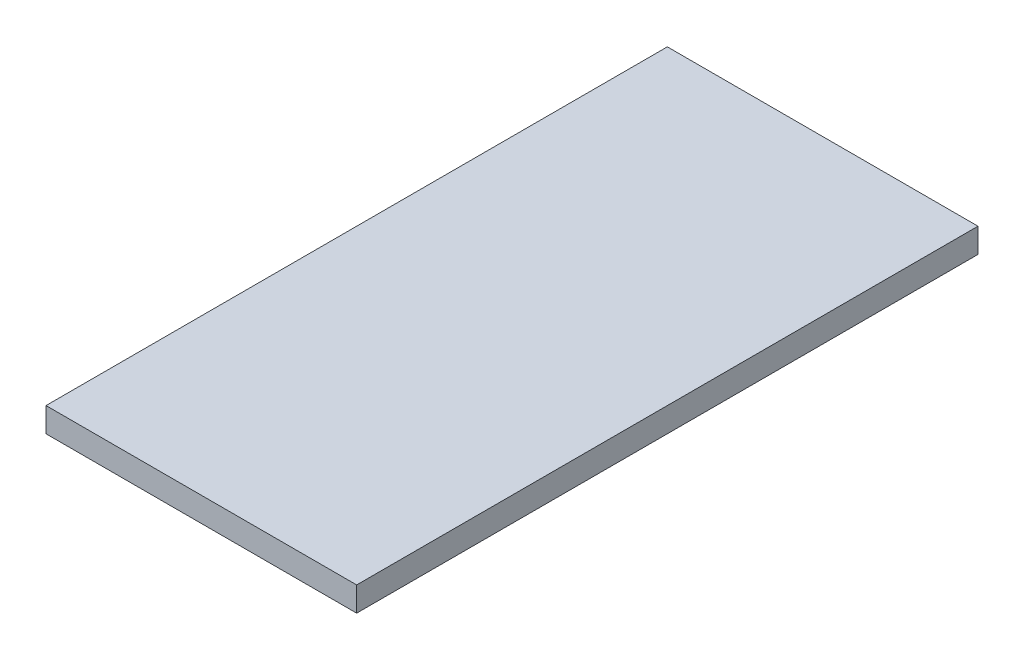
ISO-10303-21;
HEADER;
FILE_DESCRIPTION(('STEP AP214'),'2;1');
FILE_NAME('part.step','',(''),(''),'','','');
FILE_SCHEMA(('AUTOMOTIVE_DESIGN { 1 0 10303 214 1 1 1 1 }'));
ENDSEC;
DATA;
#1=APPLICATION_CONTEXT('core data for automotive mechanical design processes');
#2=APPLICATION_PROTOCOL_DEFINITION('international standard','automotive_design',2000,#1);
#3=PRODUCT_CONTEXT('',#1,'mechanical');
#4=PRODUCT('Part','Part','',(#3));
#5=PRODUCT_RELATED_PRODUCT_CATEGORY('part','',(#4));
#6=PRODUCT_DEFINITION_FORMATION('','',#4);
#7=PRODUCT_DEFINITION_CONTEXT('part definition',#1,'design');
#8=PRODUCT_DEFINITION('design','',#6,#7);
#9=PRODUCT_DEFINITION_SHAPE('','',#8);
#10=(LENGTH_UNIT() NAMED_UNIT(*) SI_UNIT(.MILLI.,.METRE.));
#11=(NAMED_UNIT(*) PLANE_ANGLE_UNIT() SI_UNIT($,.RADIAN.));
#12=(NAMED_UNIT(*) SI_UNIT($,.STERADIAN.) SOLID_ANGLE_UNIT());
#13=UNCERTAINTY_MEASURE_WITH_UNIT(LENGTH_MEASURE(1.E-05),#10,'distance_accuracy_value','');
#14=(GEOMETRIC_REPRESENTATION_CONTEXT(3) GLOBAL_UNCERTAINTY_ASSIGNED_CONTEXT((#13)) GLOBAL_UNIT_ASSIGNED_CONTEXT((#10,
#11,#12)) REPRESENTATION_CONTEXT('',''));
#15=CARTESIAN_POINT('',(0.,0.,0.));
#16=DIRECTION('',(0.,0.,1.));
#17=DIRECTION('',(1.,0.,0.));
#18=AXIS2_PLACEMENT_3D('',#15,#16,#17);
#19=CARTESIAN_POINT('',(0.,2.,0.));
#20=DIRECTION('',(1.,0.,0.));
#21=DIRECTION('',(0.,0.,-1.));
#22=AXIS2_PLACEMENT_3D('',#19,#20,#21);
#23=PLANE('',#22);
#24=DIRECTION('',(0.,0.,1.));
#25=VECTOR('',#24,1.);
#26=CARTESIAN_POINT('',(0.,0.,0.));
#27=LINE('',#26,#25);
#28=CARTESIAN_POINT('',(0.,0.,-50.8));
#29=VERTEX_POINT('',#28);
#30=CARTESIAN_POINT('',(0.,0.,0.));
#31=VERTEX_POINT('',#30);
#32=EDGE_CURVE('E101',#29,#31,#27,.T.);
#33=ORIENTED_EDGE('',*,*,#32,.T.);
#34=DIRECTION('',(0.,-1.,0.));
#35=VECTOR('',#34,1.);
#36=CARTESIAN_POINT('',(0.,2.,0.));
#37=LINE('',#36,#35);
#38=CARTESIAN_POINT('',(0.,2.,0.));
#39=VERTEX_POINT('',#38);
#40=EDGE_CURVE('E11',#39,#31,#37,.T.);
#41=ORIENTED_EDGE('',*,*,#40,.F.);
#42=DIRECTION('',(0.,0.,1.));
#43=VECTOR('',#42,1.);
#44=CARTESIAN_POINT('',(0.,2.,0.));
#45=LINE('',#44,#43);
#46=CARTESIAN_POINT('',(0.,2.,-50.8));
#47=VERTEX_POINT('',#46);
#48=EDGE_CURVE('E89',#47,#39,#45,.T.);
#49=ORIENTED_EDGE('',*,*,#48,.F.);
#50=DIRECTION('',(0.,-1.,0.));
#51=VECTOR('',#50,1.);
#52=CARTESIAN_POINT('',(0.,2.,-50.8));
#53=LINE('',#52,#51);
#54=EDGE_CURVE('E97',#47,#29,#53,.T.);
#55=ORIENTED_EDGE('',*,*,#54,.T.);
#56=EDGE_LOOP('',(#33,#41,#49,#55));
#57=FACE_BOUND('',#56,.T.);
#58=ADVANCED_FACE('F38',(#57),#23,.F.);
#59=CARTESIAN_POINT('',(0.,2.,0.));
#60=DIRECTION('',(0.,0.,-1.));
#61=DIRECTION('',(-1.,0.,0.));
#62=AXIS2_PLACEMENT_3D('',#59,#60,#61);
#63=PLANE('',#62);
#64=DIRECTION('',(1.,0.,0.));
#65=VECTOR('',#64,1.);
#66=CARTESIAN_POINT('',(0.,0.,0.));
#67=LINE('',#66,#65);
#68=CARTESIAN_POINT('',(25.4,0.,0.));
#69=VERTEX_POINT('',#68);
#70=EDGE_CURVE('E93',#31,#69,#67,.T.);
#71=ORIENTED_EDGE('',*,*,#70,.T.);
#72=DIRECTION('',(0.,-1.,0.));
#73=VECTOR('',#72,1.);
#74=CARTESIAN_POINT('',(25.4,2.,0.));
#75=LINE('',#74,#73);
#76=CARTESIAN_POINT('',(25.4,2.,0.));
#77=VERTEX_POINT('',#76);
#78=EDGE_CURVE('E46',#77,#69,#75,.T.);
#79=ORIENTED_EDGE('',*,*,#78,.F.);
#80=DIRECTION('',(1.,0.,0.));
#81=VECTOR('',#80,1.);
#82=CARTESIAN_POINT('',(0.,2.,0.));
#83=LINE('',#82,#81);
#84=EDGE_CURVE('E84',#39,#77,#83,.T.);
#85=ORIENTED_EDGE('',*,*,#84,.F.);
#86=ORIENTED_EDGE('',*,*,#40,.T.);
#87=EDGE_LOOP('',(#71,#79,#85,#86));
#88=FACE_BOUND('',#87,.T.);
#89=ADVANCED_FACE('F92',(#88),#63,.F.);
#90=CARTESIAN_POINT('',(25.4,2.,0.));
#91=DIRECTION('',(-1.,0.,0.));
#92=DIRECTION('',(0.,0.,1.));
#93=AXIS2_PLACEMENT_3D('',#90,#91,#92);
#94=PLANE('',#93);
#95=DIRECTION('',(0.,0.,-1.));
#96=VECTOR('',#95,1.);
#97=CARTESIAN_POINT('',(25.4,0.,0.));
#98=LINE('',#97,#96);
#99=CARTESIAN_POINT('',(25.4,0.,-50.8));
#100=VERTEX_POINT('',#99);
#101=EDGE_CURVE('E71',#69,#100,#98,.T.);
#102=ORIENTED_EDGE('',*,*,#101,.T.);
#103=DIRECTION('',(0.,-1.,0.));
#104=VECTOR('',#103,1.);
#105=CARTESIAN_POINT('',(25.4,2.,-50.8));
#106=LINE('',#105,#104);
#107=CARTESIAN_POINT('',(25.4,2.,-50.8));
#108=VERTEX_POINT('',#107);
#109=EDGE_CURVE('E94',#108,#100,#106,.T.);
#110=ORIENTED_EDGE('',*,*,#109,.F.);
#111=DIRECTION('',(0.,0.,-1.));
#112=VECTOR('',#111,1.);
#113=CARTESIAN_POINT('',(25.4,2.,0.));
#114=LINE('',#113,#112);
#115=EDGE_CURVE('E87',#77,#108,#114,.T.);
#116=ORIENTED_EDGE('',*,*,#115,.F.);
#117=ORIENTED_EDGE('',*,*,#78,.T.);
#118=EDGE_LOOP('',(#102,#110,#116,#117));
#119=FACE_BOUND('',#118,.T.);
#120=ADVANCED_FACE('F95',(#119),#94,.F.);
#121=CARTESIAN_POINT('',(0.,2.,-50.8));
#122=DIRECTION('',(0.,0.,1.));
#123=DIRECTION('',(1.,0.,0.));
#124=AXIS2_PLACEMENT_3D('',#121,#122,#123);
#125=PLANE('',#124);
#126=DIRECTION('',(-1.,0.,0.));
#127=VECTOR('',#126,1.);
#128=CARTESIAN_POINT('',(0.,0.,-50.8));
#129=LINE('',#128,#127);
#130=EDGE_CURVE('E77',#100,#29,#129,.T.);
#131=ORIENTED_EDGE('',*,*,#130,.T.);
#132=ORIENTED_EDGE('',*,*,#54,.F.);
#133=DIRECTION('',(-1.,0.,0.));
#134=VECTOR('',#133,1.);
#135=CARTESIAN_POINT('',(0.,2.,-50.8));
#136=LINE('',#135,#134);
#137=EDGE_CURVE('E54',#108,#47,#136,.T.);
#138=ORIENTED_EDGE('',*,*,#137,.F.);
#139=ORIENTED_EDGE('',*,*,#109,.T.);
#140=EDGE_LOOP('',(#131,#132,#138,#139));
#141=FACE_BOUND('',#140,.T.);
#142=ADVANCED_FACE('F108',(#141),#125,.F.);
#143=CARTESIAN_POINT('',(0.,2.,0.));
#144=DIRECTION('',(0.,-1.,0.));
#145=DIRECTION('',(0.,0.,-1.));
#146=AXIS2_PLACEMENT_3D('',#143,#144,#145);
#147=PLANE('',#146);
#148=ORIENTED_EDGE('',*,*,#48,.T.);
#149=ORIENTED_EDGE('',*,*,#84,.T.);
#150=ORIENTED_EDGE('',*,*,#115,.T.);
#151=ORIENTED_EDGE('',*,*,#137,.T.);
#152=EDGE_LOOP('',(#148,#149,#150,#151));
#153=FACE_BOUND('',#152,.T.);
#154=ADVANCED_FACE('F85',(#153),#147,.F.);
#155=CARTESIAN_POINT('',(0.,0.,0.));
#156=DIRECTION('',(0.,-1.,0.));
#157=DIRECTION('',(0.,0.,-1.));
#158=AXIS2_PLACEMENT_3D('',#155,#156,#157);
#159=PLANE('',#158);
#160=ORIENTED_EDGE('',*,*,#32,.F.);
#161=ORIENTED_EDGE('',*,*,#130,.F.);
#162=ORIENTED_EDGE('',*,*,#101,.F.);
#163=ORIENTED_EDGE('',*,*,#70,.F.);
#164=EDGE_LOOP('',(#160,#161,#162,#163));
#165=FACE_BOUND('',#164,.T.);
#166=ADVANCED_FACE('F111',(#165),#159,.T.);
#167=CLOSED_SHELL('',(#58,#89,#120,#142,#154,#166));
#168=MANIFOLD_SOLID_BREP('B2',#167);
#169=ADVANCED_BREP_SHAPE_REPRESENTATION('',(#18,#168),#14);
#170=SHAPE_DEFINITION_REPRESENTATION(#9,#169);
ENDSEC;
END-ISO-10303-21;
